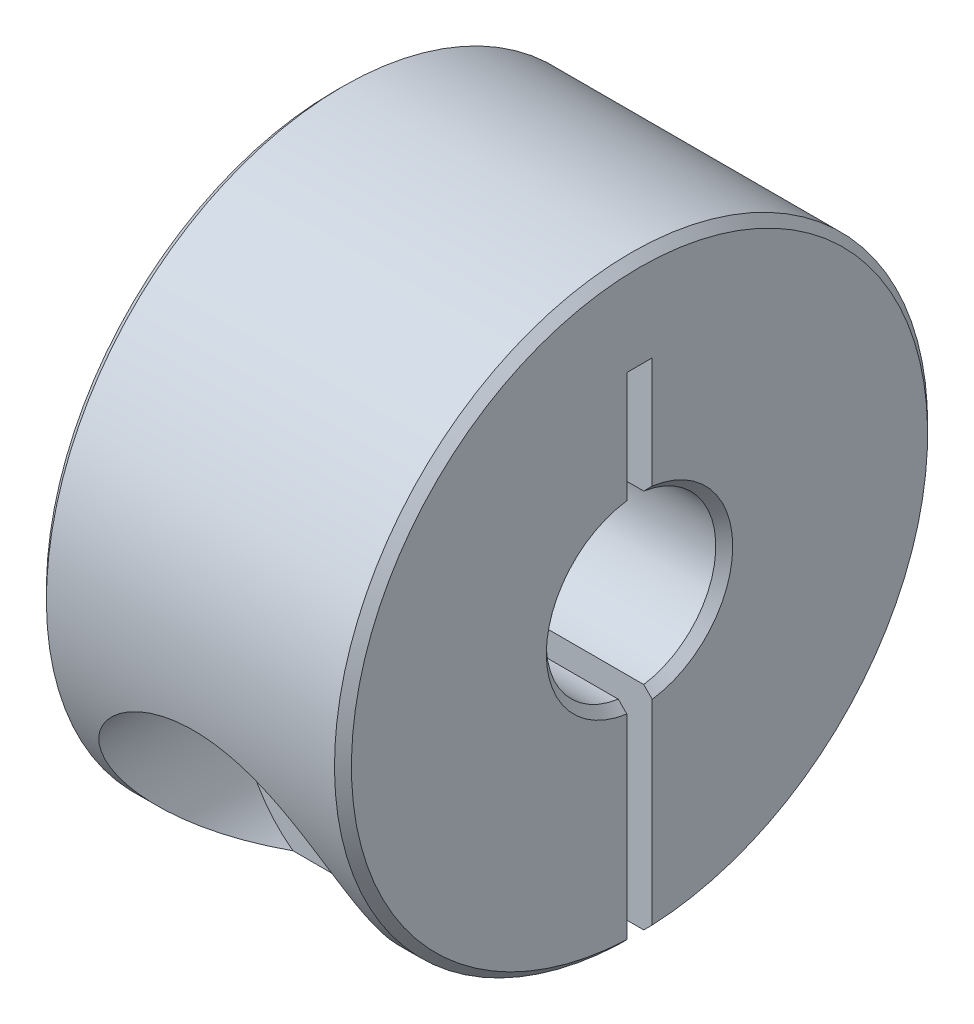
ISO-10303-21;
HEADER;
FILE_DESCRIPTION(('STEP AP214'),'2;1');
FILE_NAME('part.step','',(''),(''),'','','');
FILE_SCHEMA(('AUTOMOTIVE_DESIGN { 1 0 10303 214 1 1 1 1 }'));
ENDSEC;
DATA;
#1=APPLICATION_CONTEXT('core data for automotive mechanical design processes');
#2=APPLICATION_PROTOCOL_DEFINITION('international standard','automotive_design',2000,#1);
#3=PRODUCT_CONTEXT('',#1,'mechanical');
#4=PRODUCT('Part','Part','',(#3));
#5=PRODUCT_RELATED_PRODUCT_CATEGORY('part','',(#4));
#6=PRODUCT_DEFINITION_FORMATION('','',#4);
#7=PRODUCT_DEFINITION_CONTEXT('part definition',#1,'design');
#8=PRODUCT_DEFINITION('design','',#6,#7);
#9=PRODUCT_DEFINITION_SHAPE('','',#8);
#10=(LENGTH_UNIT() NAMED_UNIT(*) SI_UNIT(.MILLI.,.METRE.));
#11=(NAMED_UNIT(*) PLANE_ANGLE_UNIT() SI_UNIT($,.RADIAN.));
#12=(NAMED_UNIT(*) SI_UNIT($,.STERADIAN.) SOLID_ANGLE_UNIT());
#13=UNCERTAINTY_MEASURE_WITH_UNIT(LENGTH_MEASURE(1.E-05),#10,'distance_accuracy_value','');
#14=(GEOMETRIC_REPRESENTATION_CONTEXT(3) GLOBAL_UNCERTAINTY_ASSIGNED_CONTEXT((#13)) GLOBAL_UNIT_ASSIGNED_CONTEXT((#10,
#11,#12)) REPRESENTATION_CONTEXT('',''));
#15=CARTESIAN_POINT('',(0.,0.,0.));
#16=DIRECTION('',(0.,0.,1.));
#17=DIRECTION('',(1.,0.,0.));
#18=AXIS2_PLACEMENT_3D('',#15,#16,#17);
#19=CARTESIAN_POINT('',(9.,12.,-0.75));
#20=DIRECTION('',(0.,1.,0.));
#21=DIRECTION('',(0.,0.,1.));
#22=AXIS2_PLACEMENT_3D('',#19,#20,#21);
#23=PLANE('',#22);
#24=DIRECTION('',(-1.,0.,0.));
#25=VECTOR('',#24,1.);
#26=CARTESIAN_POINT('',(9.,12.,-0.75));
#27=LINE('',#26,#25);
#28=CARTESIAN_POINT('',(-9.,12.,-0.75));
#29=VERTEX_POINT('',#28);
#30=CARTESIAN_POINT('',(9.,12.,-0.75));
#31=VERTEX_POINT('',#30);
#32=EDGE_CURVE('E314',#29,#31,#27,.F.);
#33=ORIENTED_EDGE('',*,*,#32,.T.);
#34=DIRECTION('',(0.,0.,1.));
#35=VECTOR('',#34,1.);
#36=CARTESIAN_POINT('',(9.,12.,-0.75));
#37=LINE('',#36,#35);
#38=CARTESIAN_POINT('',(9.,12.,0.75));
#39=VERTEX_POINT('',#38);
#40=EDGE_CURVE('E160',#39,#31,#37,.F.);
#41=ORIENTED_EDGE('',*,*,#40,.F.);
#42=DIRECTION('',(1.,0.,0.));
#43=VECTOR('',#42,1.);
#44=CARTESIAN_POINT('',(9.,12.,0.75));
#45=LINE('',#44,#43);
#46=CARTESIAN_POINT('',(-9.,12.,0.75));
#47=VERTEX_POINT('',#46);
#48=EDGE_CURVE('E159',#39,#47,#45,.F.);
#49=ORIENTED_EDGE('',*,*,#48,.T.);
#50=DIRECTION('',(0.,0.,1.));
#51=VECTOR('',#50,1.);
#52=CARTESIAN_POINT('',(-9.,12.,-0.75));
#53=LINE('',#52,#51);
#54=EDGE_CURVE('E131',#29,#47,#53,.T.);
#55=ORIENTED_EDGE('',*,*,#54,.F.);
#56=EDGE_LOOP('',(#33,#41,#49,#55));
#57=FACE_BOUND('',#56,.T.);
#58=ADVANCED_FACE('F17',(#57),#23,.F.);
#59=CARTESIAN_POINT('',(0.,0.,0.));
#60=DIRECTION('',(1.,0.,0.));
#61=DIRECTION('',(0.,0.,-1.));
#62=AXIS2_PLACEMENT_3D('',#59,#60,#61);
#63=CYLINDRICAL_SURFACE('',#62,5.);
#64=CARTESIAN_POINT('',(8.50000000002638,0.,0.));
#65=DIRECTION('',(1.,0.,0.));
#66=DIRECTION('',(0.,1.,0.));
#67=AXIS2_PLACEMENT_3D('',#64,#65,#66);
#68=CIRCLE('',#67,4.99999999999545);
#69=CARTESIAN_POINT('',(8.50000000002865,4.943429983319,0.75));
#70=VERTEX_POINT('',#69);
#71=CARTESIAN_POINT('',(8.50000000002236,-4.94342998331493,0.75));
#72=VERTEX_POINT('',#71);
#73=EDGE_CURVE('E130',#70,#72,#68,.T.);
#74=ORIENTED_EDGE('',*,*,#73,.T.);
#75=DIRECTION('',(1.,0.,0.));
#76=VECTOR('',#75,1.);
#77=CARTESIAN_POINT('',(9.,-4.9434299833213,0.75));
#78=LINE('',#77,#76);
#79=CARTESIAN_POINT('',(-8.50000000002865,-4.943429983319,0.75));
#80=VERTEX_POINT('',#79);
#81=EDGE_CURVE('E322',#72,#80,#78,.F.);
#82=ORIENTED_EDGE('',*,*,#81,.T.);
#83=CARTESIAN_POINT('',(-8.50000000002638,0.,0.));
#84=DIRECTION('',(-1.,0.,0.));
#85=DIRECTION('',(0.,1.,0.));
#86=AXIS2_PLACEMENT_3D('',#83,#84,#85);
#87=CIRCLE('',#86,4.99999999999545);
#88=CARTESIAN_POINT('',(-8.50000000002865,4.943429983319,0.75));
#89=VERTEX_POINT('',#88);
#90=EDGE_CURVE('E319',#80,#89,#87,.T.);
#91=ORIENTED_EDGE('',*,*,#90,.T.);
#92=DIRECTION('',(1.,0.,0.));
#93=VECTOR('',#92,1.);
#94=CARTESIAN_POINT('',(9.,4.9434299833213,0.75));
#95=LINE('',#94,#93);
#96=EDGE_CURVE('E156',#89,#70,#95,.T.);
#97=ORIENTED_EDGE('',*,*,#96,.T.);
#98=EDGE_LOOP('',(#74,#82,#91,#97));
#99=FACE_BOUND('',#98,.T.);
#100=ADVANCED_FACE('F395',(#99),#63,.F.);
#101=CARTESIAN_POINT('',(0.,-10.,3.5));
#102=DIRECTION('',(0.,0.,1.));
#103=DIRECTION('',(1.,0.,0.));
#104=AXIS2_PLACEMENT_3D('',#101,#102,#103);
#105=CYLINDRICAL_SURFACE('',#104,3.3);
#106=CARTESIAN_POINT('',(0.,-10.,0.75));
#107=DIRECTION('',(0.,0.,1.));
#108=DIRECTION('',(1.,0.,0.));
#109=AXIS2_PLACEMENT_3D('',#106,#107,#108);
#110=CIRCLE('',#109,3.3);
#111=CARTESIAN_POINT('',(3.3,-10.,0.75));
#112=VERTEX_POINT('',#111);
#113=EDGE_CURVE('E334',#112,#112,#110,.F.);
#114=ORIENTED_EDGE('',*,*,#113,.T.);
#115=EDGE_LOOP('',(#114));
#116=FACE_BOUND('',#115,.T.);
#117=CARTESIAN_POINT('',(0.,-10.,7.));
#118=DIRECTION('',(0.,0.,1.));
#119=DIRECTION('',(1.,0.,0.));
#120=AXIS2_PLACEMENT_3D('',#117,#118,#119);
#121=CIRCLE('',#120,3.3);
#122=CARTESIAN_POINT('',(3.3,-10.,7.));
#123=VERTEX_POINT('',#122);
#124=EDGE_CURVE('E140',#123,#123,#121,.T.);
#125=ORIENTED_EDGE('',*,*,#124,.T.);
#126=EDGE_LOOP('',(#125));
#127=FACE_BOUND('',#126,.T.);
#128=ADVANCED_FACE('F407',(#116,#127),#105,.F.);
#129=CARTESIAN_POINT('',(9.00000000001455,0.,0.));
#130=DIRECTION('',(1.,0.,0.));
#131=DIRECTION('',(0.,0.,-1.));
#132=AXIS2_PLACEMENT_3D('',#129,#130,#131);
#133=CONICAL_SURFACE('',#132,5.49999999998363,0.785398163397448);
#134=CARTESIAN_POINT('',(8.5,0.,0.));
#135=DIRECTION('',(1.,0.,0.));
#136=DIRECTION('',(0.,0.,-1.));
#137=AXIS2_PLACEMENT_3D('',#134,#135,#136);
#138=CIRCLE('',#137,5.);
#139=CARTESIAN_POINT('',(8.50000000000863,4.94342998331439,-0.75));
#140=VERTEX_POINT('',#139);
#141=CARTESIAN_POINT('',(8.50000000001133,-4.94342998331712,-0.75));
#142=VERTEX_POINT('',#141);
#143=EDGE_CURVE('E133',#140,#142,#138,.F.);
#144=ORIENTED_EDGE('',*,*,#143,.T.);
#145=CARTESIAN_POINT('',(9.00000000001252,-5.44862367941236,-0.750000000003947));
#146=CARTESIAN_POINT('',(8.91662480487354,-5.36446616199563,-0.750000000001974));
#147=CARTESIAN_POINT('',(8.83327054076079,-5.28028792873627,-0.750000000000658));
#148=CARTESIAN_POINT('',(8.66660387409726,-5.11189003003671,-0.749999999999342));
#149=CARTESIAN_POINT('',(8.58329147154672,-5.02767036459626,-0.749999999999342));
#150=CARTESIAN_POINT('',(8.50000000002266,-4.94342998331294,-0.75));
#151=B_SPLINE_CURVE_WITH_KNOTS('',3,(#145,#146,#147,#148,#149,#150),.UNSPECIFIED.,.F.,.F.,(4,2,
4),(0.,0.355394393180337,0.710788788452376),.UNSPECIFIED.);
#152=CARTESIAN_POINT('',(9.00000000001481,-5.44862367940958,-0.75));
#153=VERTEX_POINT('',#152);
#154=EDGE_CURVE('E20',#153,#142,#151,.T.);
#155=ORIENTED_EDGE('',*,*,#154,.F.);
#156=CARTESIAN_POINT('',(9.00000000001455,0.,0.));
#157=DIRECTION('',(1.,0.,0.));
#158=DIRECTION('',(0.,0.,-1.));
#159=AXIS2_PLACEMENT_3D('',#156,#157,#158);
#160=CIRCLE('',#159,5.49999999998363);
#161=CARTESIAN_POINT('',(9.00000000001499,5.44862367940976,-0.75));
#162=VERTEX_POINT('',#161);
#163=EDGE_CURVE('E308',#162,#153,#160,.F.);
#164=ORIENTED_EDGE('',*,*,#163,.F.);
#165=CARTESIAN_POINT('',(9.00000000001543,5.4486236794102,-0.75));
#166=CARTESIAN_POINT('',(8.91662480487422,5.36446616199377,-0.75));
#167=CARTESIAN_POINT('',(8.83327054075965,5.28028792873427,-0.75));
#168=CARTESIAN_POINT('',(8.66660387409335,5.11189003003361,-0.75));
#169=CARTESIAN_POINT('',(8.58329147154186,5.0276703645922,-0.75));
#170=CARTESIAN_POINT('',(8.50000000001727,4.94342998330749,-0.75));
#171=B_SPLINE_CURVE_WITH_KNOTS('',3,(#165,#166,#167,#168,#169,#170),.UNSPECIFIED.,.F.,.F.,(4,2,
4),(0.,0.35539439318443,0.710788788460557),.UNSPECIFIED.);
#172=EDGE_CURVE('E135',#162,#140,#171,.T.);
#173=ORIENTED_EDGE('',*,*,#172,.T.);
#174=EDGE_LOOP('',(#144,#155,#164,#173));
#175=FACE_BOUND('',#174,.T.);
#176=ADVANCED_FACE('F134',(#175),#133,.F.);
#177=CARTESIAN_POINT('',(9.00000000001455,0.,0.));
#178=DIRECTION('',(1.,0.,0.));
#179=DIRECTION('',(0.,0.,-1.));
#180=AXIS2_PLACEMENT_3D('',#177,#178,#179);
#181=CONICAL_SURFACE('',#180,5.49999999998363,0.785398163397448);
#182=CARTESIAN_POINT('',(9.00000000001455,0.,0.));
#183=DIRECTION('',(1.,0.,0.));
#184=DIRECTION('',(0.,0.,-1.));
#185=AXIS2_PLACEMENT_3D('',#182,#183,#184);
#186=CIRCLE('',#185,5.49999999998363);
#187=CARTESIAN_POINT('',(9.00000000001499,-5.44862367940976,0.75));
#188=VERTEX_POINT('',#187);
#189=CARTESIAN_POINT('',(9.00000000001499,5.44862367940976,0.75));
#190=VERTEX_POINT('',#189);
#191=EDGE_CURVE('E304',#188,#190,#186,.F.);
#192=ORIENTED_EDGE('',*,*,#191,.F.);
#193=CARTESIAN_POINT('',(9.00000000001543,-5.4486236794102,0.75));
#194=CARTESIAN_POINT('',(8.9166248048744,-5.36446616199395,0.75));
#195=CARTESIAN_POINT('',(8.83327054076001,-5.28028792873464,0.75));
#196=CARTESIAN_POINT('',(8.66660387409407,-5.11189003003434,0.75));
#197=CARTESIAN_POINT('',(8.58329147154276,-5.0276703645931,0.75));
#198=CARTESIAN_POINT('',(8.50000000001834,-4.94342998330857,0.75));
#199=B_SPLINE_CURVE_WITH_KNOTS('',3,(#193,#194,#195,#196,#197,#198),.UNSPECIFIED.,.F.,.F.,(4,2,
4),(0.,0.355394393183667,0.710788788459035),.UNSPECIFIED.);
#200=EDGE_CURVE('E324',#188,#72,#199,.T.);
#201=ORIENTED_EDGE('',*,*,#200,.T.);
#202=ORIENTED_EDGE('',*,*,#73,.F.);
#203=CARTESIAN_POINT('',(8.50000000001834,4.94342998330857,0.75));
#204=CARTESIAN_POINT('',(8.58329147154276,5.0276703645931,0.75));
#205=CARTESIAN_POINT('',(8.66660387409407,5.11189003003433,0.75));
#206=CARTESIAN_POINT('',(8.83327054076001,5.28028792873464,0.75));
#207=CARTESIAN_POINT('',(8.9166248048744,5.36446616199395,0.75));
#208=CARTESIAN_POINT('',(9.00000000001543,5.4486236794102,0.75));
#209=B_SPLINE_CURVE_WITH_KNOTS('',3,(#203,#204,#205,#206,#207,#208),.UNSPECIFIED.,.F.,.F.,(4,2,
4),(0.,0.355394395275367,0.710788788459035),.UNSPECIFIED.);
#210=EDGE_CURVE('E158',#70,#190,#209,.T.);
#211=ORIENTED_EDGE('',*,*,#210,.T.);
#212=EDGE_LOOP('',(#192,#201,#202,#211));
#213=FACE_BOUND('',#212,.T.);
#214=ADVANCED_FACE('F372',(#213),#181,.F.);
#215=CARTESIAN_POINT('',(9.,-17.5,-0.75));
#216=DIRECTION('',(0.,0.,-1.));
#217=DIRECTION('',(-1.,0.,0.));
#218=AXIS2_PLACEMENT_3D('',#215,#216,#217);
#219=PLANE('',#218);
#220=DIRECTION('',(0.,1.,0.));
#221=VECTOR('',#220,1.);
#222=CARTESIAN_POINT('',(9.,11.25,-0.75));
#223=LINE('',#222,#221);
#224=EDGE_CURVE('E309',#31,#162,#223,.F.);
#225=ORIENTED_EDGE('',*,*,#224,.F.);
#226=ORIENTED_EDGE('',*,*,#32,.F.);
#227=DIRECTION('',(0.,1.,0.));
#228=VECTOR('',#227,1.);
#229=CARTESIAN_POINT('',(-9.,11.25,-0.75));
#230=LINE('',#229,#228);
#231=CARTESIAN_POINT('',(-9.00000000000753,5.44862367940223,-0.75));
#232=VERTEX_POINT('',#231);
#233=EDGE_CURVE('E288',#232,#29,#230,.T.);
#234=ORIENTED_EDGE('',*,*,#233,.F.);
#235=CARTESIAN_POINT('',(-9.00000000001252,5.44862367941236,-0.750000000003948));
#236=CARTESIAN_POINT('',(-8.91662480487354,5.36446616199563,-0.750000000001974));
#237=CARTESIAN_POINT('',(-8.83327054076079,5.28028792873627,-0.750000000000658));
#238=CARTESIAN_POINT('',(-8.66660387409726,5.11189003003671,-0.749999999999342));
#239=CARTESIAN_POINT('',(-8.58329147154672,5.02767036459626,-0.749999999999342));
#240=CARTESIAN_POINT('',(-8.50000000002266,4.94342998331294,-0.75));
#241=B_SPLINE_CURVE_WITH_KNOTS('',3,(#235,#236,#237,#238,#239,#240),.UNSPECIFIED.,.F.,.F.,(4,2,
4),(0.,0.355394393180337,0.710788788452376),.UNSPECIFIED.);
#242=CARTESIAN_POINT('',(-8.50000000001133,4.94342998331712,-0.75));
#243=VERTEX_POINT('',#242);
#244=EDGE_CURVE('E330',#232,#243,#241,.T.);
#245=ORIENTED_EDGE('',*,*,#244,.T.);
#246=DIRECTION('',(1.,0.,0.));
#247=VECTOR('',#246,1.);
#248=CARTESIAN_POINT('',(0.,4.9434299833213,-0.75));
#249=LINE('',#248,#247);
#250=EDGE_CURVE('E154',#243,#140,#249,.T.);
#251=ORIENTED_EDGE('',*,*,#250,.T.);
#252=ORIENTED_EDGE('',*,*,#172,.F.);
#253=EDGE_LOOP('',(#225,#226,#234,#245,#251,#252));
#254=FACE_BOUND('',#253,.T.);
#255=ADVANCED_FACE('F329',(#254),#219,.F.);
#256=CARTESIAN_POINT('',(9.,12.,0.75));
#257=DIRECTION('',(0.,0.,1.));
#258=DIRECTION('',(1.,0.,0.));
#259=AXIS2_PLACEMENT_3D('',#256,#257,#258);
#260=PLANE('',#259);
#261=ORIENTED_EDGE('',*,*,#96,.F.);
#262=CARTESIAN_POINT('',(-8.50000000002536,4.94342998331567,0.75));
#263=CARTESIAN_POINT('',(-8.58329147154855,5.02767036459896,0.75));
#264=CARTESIAN_POINT('',(-8.66660387409863,5.11189003003895,0.75));
#265=CARTESIAN_POINT('',(-8.83327054076211,5.28028792873676,0.75));
#266=CARTESIAN_POINT('',(-8.91662480487527,5.36446616199483,0.75));
#267=CARTESIAN_POINT('',(-9.00000000001507,5.44862367940984,0.75));
#268=B_SPLINE_CURVE_WITH_KNOTS('',3,(#262,#263,#264,#265,#266,#267),.UNSPECIFIED.,.F.,.F.,(4,2,
4),(0.,0.355394395270117,0.710788788448535),.UNSPECIFIED.);
#269=CARTESIAN_POINT('',(-9.00000000001481,5.44862367940958,0.75));
#270=VERTEX_POINT('',#269);
#271=EDGE_CURVE('E321',#89,#270,#268,.T.);
#272=ORIENTED_EDGE('',*,*,#271,.T.);
#273=DIRECTION('',(0.,1.,0.));
#274=VECTOR('',#273,1.);
#275=CARTESIAN_POINT('',(-9.,11.25,0.75));
#276=LINE('',#275,#274);
#277=EDGE_CURVE('E285',#47,#270,#276,.F.);
#278=ORIENTED_EDGE('',*,*,#277,.F.);
#279=ORIENTED_EDGE('',*,*,#48,.F.);
#280=DIRECTION('',(0.,1.,0.));
#281=VECTOR('',#280,1.);
#282=CARTESIAN_POINT('',(9.,11.25,0.75));
#283=LINE('',#282,#281);
#284=EDGE_CURVE('E290',#190,#39,#283,.T.);
#285=ORIENTED_EDGE('',*,*,#284,.F.);
#286=ORIENTED_EDGE('',*,*,#210,.F.);
#287=EDGE_LOOP('',(#261,#272,#278,#279,#285,#286));
#288=FACE_BOUND('',#287,.T.);
#289=ADVANCED_FACE('F358',(#288),#260,.F.);
#290=CARTESIAN_POINT('',(-9.00000000001455,0.,0.));
#291=DIRECTION('',(-1.,0.,0.));
#292=DIRECTION('',(0.,0.,1.));
#293=AXIS2_PLACEMENT_3D('',#290,#291,#292);
#294=CONICAL_SURFACE('',#293,5.49999999998363,0.785398163397448);
#295=ORIENTED_EDGE('',*,*,#90,.F.);
#296=CARTESIAN_POINT('',(-8.50000000001997,-4.94342998331022,0.75));
#297=CARTESIAN_POINT('',(-8.58329147154412,-5.02767036459448,0.75));
#298=CARTESIAN_POINT('',(-8.66660387409516,-5.11189003003544,0.75));
#299=CARTESIAN_POINT('',(-8.83327054076056,-5.28028792873519,0.75));
#300=CARTESIAN_POINT('',(-8.91662480487467,-5.36446616199422,0.75));
#301=CARTESIAN_POINT('',(-9.00000000001543,-5.4486236794102,0.75));
#302=B_SPLINE_CURVE_WITH_KNOTS('',3,(#296,#297,#298,#299,#300,#301),.UNSPECIFIED.,.F.,.F.,(4,2,
4),(0.,0.355394395274206,0.710788788456713),.UNSPECIFIED.);
#303=CARTESIAN_POINT('',(-9.00000000001499,-5.44862367940976,0.75));
#304=VERTEX_POINT('',#303);
#305=EDGE_CURVE('E223',#80,#304,#302,.T.);
#306=ORIENTED_EDGE('',*,*,#305,.T.);
#307=CARTESIAN_POINT('',(-9.00000000001455,0.,0.));
#308=DIRECTION('',(-1.,0.,0.));
#309=DIRECTION('',(0.,0.,1.));
#310=AXIS2_PLACEMENT_3D('',#307,#308,#309);
#311=CIRCLE('',#310,5.49999999998363);
#312=EDGE_CURVE('E284',#270,#304,#311,.F.);
#313=ORIENTED_EDGE('',*,*,#312,.F.);
#314=ORIENTED_EDGE('',*,*,#271,.F.);
#315=EDGE_LOOP('',(#295,#306,#313,#314));
#316=FACE_BOUND('',#315,.T.);
#317=ADVANCED_FACE('F354',(#316),#294,.F.);
#318=CARTESIAN_POINT('',(-9.00000000001455,0.,0.));
#319=DIRECTION('',(-1.,0.,0.));
#320=DIRECTION('',(0.,0.,1.));
#321=AXIS2_PLACEMENT_3D('',#318,#319,#320);
#322=CONICAL_SURFACE('',#321,5.49999999998363,0.785398163397448);
#323=CARTESIAN_POINT('',(-9.00000000001455,0.,0.));
#324=DIRECTION('',(-1.,0.,0.));
#325=DIRECTION('',(0.,0.,1.));
#326=AXIS2_PLACEMENT_3D('',#323,#324,#325);
#327=CIRCLE('',#326,5.49999999998363);
#328=CARTESIAN_POINT('',(-9.00000000001481,-5.44862367940958,-0.75));
#329=VERTEX_POINT('',#328);
#330=EDGE_CURVE('E192',#329,#232,#327,.F.);
#331=ORIENTED_EDGE('',*,*,#330,.F.);
#332=CARTESIAN_POINT('',(-8.50000000001996,-4.94342998331561,-0.750000000004225));
#333=CARTESIAN_POINT('',(-8.58329147154495,-5.02767036459802,-0.750000000002113));
#334=CARTESIAN_POINT('',(-8.66660387409638,-5.11189003003757,-0.750000000000704));
#335=CARTESIAN_POINT('',(-8.83327054076166,-5.2802879287354,-0.749999999999296));
#336=CARTESIAN_POINT('',(-8.91662480487527,-5.36446616199393,-0.749999999999296));
#337=CARTESIAN_POINT('',(-9.00000000001507,-5.44862367940984,-0.75));
#338=B_SPLINE_CURVE_WITH_KNOTS('',3,(#332,#333,#334,#335,#336,#337),.UNSPECIFIED.,.F.,.F.,(4,2,
4),(0.,0.355394395272037,0.710788788452374),.UNSPECIFIED.);
#339=CARTESIAN_POINT('',(-8.50000000001133,-4.94342998331712,-0.75));
#340=VERTEX_POINT('',#339);
#341=EDGE_CURVE('E335',#340,#329,#338,.T.);
#342=ORIENTED_EDGE('',*,*,#341,.F.);
#343=CARTESIAN_POINT('',(-8.5,0.,0.));
#344=DIRECTION('',(1.,0.,0.));
#345=DIRECTION('',(0.,0.,-1.));
#346=AXIS2_PLACEMENT_3D('',#343,#344,#345);
#347=CIRCLE('',#346,5.);
#348=EDGE_CURVE('E139',#340,#243,#347,.T.);
#349=ORIENTED_EDGE('',*,*,#348,.T.);
#350=ORIENTED_EDGE('',*,*,#244,.F.);
#351=EDGE_LOOP('',(#331,#342,#349,#350));
#352=FACE_BOUND('',#351,.T.);
#353=ADVANCED_FACE('F351',(#352),#322,.F.);
#354=CARTESIAN_POINT('',(9.,12.,0.75));
#355=DIRECTION('',(0.,0.,1.));
#356=DIRECTION('',(1.,0.,0.));
#357=AXIS2_PLACEMENT_3D('',#354,#355,#356);
#358=PLANE('',#357);
#359=DIRECTION('',(0.,1.,0.));
#360=VECTOR('',#359,1.);
#361=CARTESIAN_POINT('',(-9.,11.25,0.75));
#362=LINE('',#361,#360);
#363=CARTESIAN_POINT('',(-9.,-16.9834478242788,0.75));
#364=VERTEX_POINT('',#363);
#365=EDGE_CURVE('E281',#304,#364,#362,.F.);
#366=ORIENTED_EDGE('',*,*,#365,.F.);
#367=ORIENTED_EDGE('',*,*,#305,.F.);
#368=ORIENTED_EDGE('',*,*,#81,.F.);
#369=ORIENTED_EDGE('',*,*,#200,.F.);
#370=DIRECTION('',(0.,1.,0.));
#371=VECTOR('',#370,1.);
#372=CARTESIAN_POINT('',(9.,11.25,0.75));
#373=LINE('',#372,#371);
#374=CARTESIAN_POINT('',(8.99999999999999,-16.9834478242788,0.75));
#375=VERTEX_POINT('',#374);
#376=EDGE_CURVE('E305',#375,#188,#373,.T.);
#377=ORIENTED_EDGE('',*,*,#376,.F.);
#378=CARTESIAN_POINT('',(8.49999999999999,-17.4839211849059,0.75));
#379=CARTESIAN_POINT('',(8.58333447834012,-17.4005101020586,0.75));
#380=CARTESIAN_POINT('',(8.66666838417682,-17.3170984472494,0.75));
#381=CARTESIAN_POINT('',(8.83333505084349,-17.1502739937071,0.75));
#382=CARTESIAN_POINT('',(8.91666781167346,-17.0668611949739,0.75));
#383=CARTESIAN_POINT('',(8.99999999999999,-16.9834478242788,0.75));
#384=B_SPLINE_CURVE_WITH_KNOTS('',3,(#378,#379,#380,#381,#382,#383),.UNSPECIFIED.,.F.,.F.,(4,2,
4),(0.,0.353720788447701,0.707441576895888),.UNSPECIFIED.);
#385=CARTESIAN_POINT('',(8.49999999999999,-17.4839211849059,0.750000000000003));
#386=VERTEX_POINT('',#385);
#387=EDGE_CURVE('E208',#386,#375,#384,.T.);
#388=ORIENTED_EDGE('',*,*,#387,.F.);
#389=DIRECTION('',(1.,0.,0.));
#390=VECTOR('',#389,1.);
#391=CARTESIAN_POINT('',(0.,-17.4839211849059,0.750000000000005));
#392=LINE('',#391,#390);
#393=CARTESIAN_POINT('',(-8.5,-17.4839211849059,0.750000000000003));
#394=VERTEX_POINT('',#393);
#395=EDGE_CURVE('E189',#394,#386,#392,.T.);
#396=ORIENTED_EDGE('',*,*,#395,.F.);
#397=CARTESIAN_POINT('',(-8.99999999999999,-16.9834478242788,0.75));
#398=CARTESIAN_POINT('',(-8.91666781167346,-17.0668611949739,0.75));
#399=CARTESIAN_POINT('',(-8.83333505084349,-17.1502739937071,0.75));
#400=CARTESIAN_POINT('',(-8.66666838417683,-17.3170984472494,0.75));
#401=CARTESIAN_POINT('',(-8.58333447834012,-17.4005101020586,0.75));
#402=CARTESIAN_POINT('',(-8.49999999999999,-17.4839211849059,0.75));
#403=B_SPLINE_CURVE_WITH_KNOTS('',3,(#397,#398,#399,#400,#401,#402),.UNSPECIFIED.,.F.,.F.,(4,2,
4),(0.,0.353720788448187,0.707441576895889),.UNSPECIFIED.);
#404=EDGE_CURVE('E216',#364,#394,#403,.T.);
#405=ORIENTED_EDGE('',*,*,#404,.F.);
#406=EDGE_LOOP('',(#366,#367,#368,#369,#377,#388,#396,#405));
#407=FACE_BOUND('',#406,.T.);
#408=ORIENTED_EDGE('',*,*,#113,.F.);
#409=EDGE_LOOP('',(#408));
#410=FACE_BOUND('',#409,.T.);
#411=ADVANCED_FACE('F200',(#407,#410),#358,.F.);
#412=CARTESIAN_POINT('',(0.,-10.,12.25));
#413=DIRECTION('',(0.,0.,1.));
#414=DIRECTION('',(1.,0.,0.));
#415=AXIS2_PLACEMENT_3D('',#412,#413,#414);
#416=CYLINDRICAL_SURFACE('',#415,7.5);
#417=CARTESIAN_POINT('',(0.,-10.,7.));
#418=DIRECTION('',(0.,0.,1.));
#419=DIRECTION('',(1.,0.,0.));
#420=AXIS2_PLACEMENT_3D('',#417,#418,#419);
#421=CIRCLE('',#420,7.5);
#422=CARTESIAN_POINT('',(-4.44750476637281,-16.0390149323454,7.00000000000001));
#423=VERTEX_POINT('',#422);
#424=CARTESIAN_POINT('',(4.44750476637281,-16.0390149323454,7.00000000000001));
#425=VERTEX_POINT('',#424);
#426=EDGE_CURVE('E215',#423,#425,#421,.F.);
#427=ORIENTED_EDGE('',*,*,#426,.T.);
#428=CARTESIAN_POINT('',(-4.44750476637281,-16.0390149323454,7.00000000000001));
#429=CARTESIAN_POINT('',(-4.56955954804997,-15.949117850043,7.2059721413126));
#430=CARTESIAN_POINT('',(-4.68980772098714,-15.8548595072587,7.41112964493417));
#431=CARTESIAN_POINT('',(-4.92616959264832,-15.6574374103529,7.81960057378549));
#432=CARTESIAN_POINT('',(-5.04228236783799,-15.5542716843945,8.02291357963219));
#433=CARTESIAN_POINT('',(-5.27019246544305,-15.338517814014,8.42809117848523));
#434=CARTESIAN_POINT('',(-5.38197340596297,-15.225898200416,8.62994829230589));
#435=CARTESIAN_POINT('',(-5.60013328646501,-14.9914073444316,9.03115149250275));
#436=CARTESIAN_POINT('',(-5.70651256869427,-14.8695366894116,9.23049773736342));
#437=CARTESIAN_POINT('',(-6.01935044847393,-14.4863371116097,9.82969393443101));
#438=CARTESIAN_POINT('',(-6.21640935120704,-14.2103061873441,10.2252405037687));
#439=CARTESIAN_POINT('',(-6.57827451089856,-13.6188741865275,11.0006097979159));
#440=CARTESIAN_POINT('',(-6.7431323560203,-13.3035374306973,11.380456891509));
#441=CARTESIAN_POINT('',(-6.96838373174463,-12.7808835787557,11.9573047465954));
#442=CARTESIAN_POINT('',(-7.04281829511678,-12.5871153406868,12.1611941984241));
#443=CARTESIAN_POINT('',(-7.17704141941539,-12.1873573735817,12.5617809811371));
#444=CARTESIAN_POINT('',(-7.23682980040736,-11.9813674944362,12.7584782236367));
#445=CARTESIAN_POINT('',(-7.33947499918348,-11.5585956795266,13.1426826622273));
#446=CARTESIAN_POINT('',(-7.38240339553908,-11.3418638652688,13.3302256830082));
#447=CARTESIAN_POINT('',(-7.44947088343624,-10.8976685376711,13.6957469825321));
#448=CARTESIAN_POINT('',(-7.47361328043574,-10.670206919749,13.8737269387946));
#449=CARTESIAN_POINT('',(-7.49848271588394,-10.2451538094771,14.1895954358461));
#450=CARTESIAN_POINT('',(-7.50247716547214,-10.0490100161887,14.3291764736407));
#451=CARTESIAN_POINT('',(-7.4945298959265,-9.65135819305877,14.5999695979797));
#452=CARTESIAN_POINT('',(-7.48259158807835,-9.44985132053225,14.7311834696758));
#453=CARTESIAN_POINT('',(-7.44147519707964,-9.0427566947008,14.9845270014167));
#454=CARTESIAN_POINT('',(-7.41228895200982,-8.83716705392436,15.1066523298336));
#455=CARTESIAN_POINT('',(-7.33550729828882,-8.42376270944296,15.3410126660908));
#456=CARTESIAN_POINT('',(-7.28791176876009,-8.21594799113658,15.4532476089835));
#457=CARTESIAN_POINT('',(-7.1729348260074,-7.79858861992143,15.6680412512137));
#458=CARTESIAN_POINT('',(-7.10540254611961,-7.58904307209935,15.7705179878946));
#459=CARTESIAN_POINT('',(-6.95007658415378,-7.17230190780332,15.9643633634668));
#460=CARTESIAN_POINT('',(-6.86228250959072,-6.96510633693162,16.05573178713));
#461=CARTESIAN_POINT('',(-6.66629430887933,-6.55588067604768,16.227126051057));
#462=CARTESIAN_POINT('',(-6.5581118731649,-6.35384770088328,16.3071583454807));
#463=CARTESIAN_POINT('',(-6.32158545217565,-5.95762859071314,16.4560458862356));
#464=CARTESIAN_POINT('',(-6.19324429588402,-5.76344135947152,16.5249026981304));
#465=CARTESIAN_POINT('',(-5.93564450889938,-5.41096912997221,16.6433539851056));
#466=CARTESIAN_POINT('',(-5.80880910596174,-5.25135813723171,16.6942931230247));
#467=CARTESIAN_POINT('',(-5.54130728047943,-4.94176376545887,16.7885422689785));
#468=CARTESIAN_POINT('',(-5.40064148704705,-4.79177994902116,16.8318526237788));
#469=CARTESIAN_POINT('',(-5.10642876865464,-4.50301222294986,16.9113961599183));
#470=CARTESIAN_POINT('',(-4.95288263490244,-4.36422762640159,16.9476297755099));
#471=CARTESIAN_POINT('',(-4.63400445329441,-4.09923927399808,17.0136677266353));
#472=CARTESIAN_POINT('',(-4.46867241406142,-3.97303550893858,17.0434720668729));
#473=CARTESIAN_POINT('',(-4.13393816799166,-3.7389559784119,17.0963171573298));
#474=CARTESIAN_POINT('',(-3.96492843951601,-3.63056647494613,17.1195716354682));
#475=CARTESIAN_POINT('',(-3.61832678265506,-3.42747694054332,17.1613855150157));
#476=CARTESIAN_POINT('',(-3.44073492260367,-3.33277680063076,17.1799449538009));
#477=CARTESIAN_POINT('',(-3.07825480461131,-3.15786448220336,17.2129551235274));
#478=CARTESIAN_POINT('',(-2.89336903853971,-3.07764740707821,17.2274072440729));
#479=CARTESIAN_POINT('',(-2.5175771921715,-2.93229680733227,17.2527402403115));
#480=CARTESIAN_POINT('',(-2.32667146524109,-2.86716239923837,17.2636213251951));
#481=CARTESIAN_POINT('',(-1.78808006729213,-2.70738206624215,17.2896238418875));
#482=CARTESIAN_POINT('',(-1.43502832178842,-2.62974027866728,17.301362883775));
#483=CARTESIAN_POINT('',(-0.721246784950899,-2.52605284906673,17.3168086052384));
#484=CARTESIAN_POINT('',(-0.360516507560753,-2.50001048319565,17.320514774792));
#485=CARTESIAN_POINT('',(0.207537699336303,-2.49999396516315,17.3205042192316));
#486=CARTESIAN_POINT('',(0.415004556789632,-2.50861472107268,17.319269943086));
#487=CARTESIAN_POINT('',(0.828536408112774,-2.54302062382049,17.3142539947343));
#488=CARTESIAN_POINT('',(1.03460127266166,-2.56880733294401,17.3104720906664));
#489=CARTESIAN_POINT('',(1.44388981064271,-2.63737362100346,17.300157488468));
#490=CARTESIAN_POINT('',(1.64711231880478,-2.6801599693771,17.2936236944431));
#491=CARTESIAN_POINT('',(2.04919664635086,-2.78239527460306,17.277469580382));
#492=CARTESIAN_POINT('',(2.24805854865994,-2.84184391429394,17.2678493190952));
#493=CARTESIAN_POINT('',(2.64007282211928,-2.97696531380355,17.2450679607307));
#494=CARTESIAN_POINT('',(2.83322290460203,-3.0526444794239,17.2319054650935));
#495=CARTESIAN_POINT('',(3.212330931359,-3.21959973834868,17.2014933284278));
#496=CARTESIAN_POINT('',(3.39828883072303,-3.31087592902642,17.1842436618826));
#497=CARTESIAN_POINT('',(3.76161271288635,-3.50823601714022,17.1450399348971));
#498=CARTESIAN_POINT('',(3.93898027461467,-3.61431717935945,17.1230867430327));
#499=CARTESIAN_POINT('',(4.28384960669858,-3.84036222915873,17.0738101179102));
#500=CARTESIAN_POINT('',(4.45135152210617,-3.9603259125508,17.0464867636339));
#501=CARTESIAN_POINT('',(4.77345892734006,-4.21161941252672,16.9861345261793));
#502=CARTESIAN_POINT('',(4.92818712153963,-4.34280799071123,16.9531724729659));
#503=CARTESIAN_POINT('',(5.22570979548738,-4.61643218949201,16.8807160915363));
#504=CARTESIAN_POINT('',(5.368504399039,-4.75886769337873,16.8412218311003));
#505=CARTESIAN_POINT('',(5.64118296482405,-5.05355240989999,16.7551531477772));
#506=CARTESIAN_POINT('',(5.77106984734887,-5.20579938984092,16.7085803324278));
#507=CARTESIAN_POINT('',(6.01719634105576,-5.51859926731203,16.6078911710848));
#508=CARTESIAN_POINT('',(6.13343612001542,-5.67915206269547,16.5537749178482));
#509=CARTESIAN_POINT('',(6.34979760266607,-6.00406445320724,16.4386857538399));
#510=CARTESIAN_POINT('',(6.45016520758534,-6.16830870277123,16.3778489964661));
#511=CARTESIAN_POINT('',(6.63686042759788,-6.50163263278037,16.2484070951328));
#512=CARTESIAN_POINT('',(6.72318830223368,-6.67071222377003,16.179802094819));
#513=CARTESIAN_POINT('',(6.88171051431675,-7.01211054336769,16.0347964766847));
#514=CARTESIAN_POINT('',(6.95390493679214,-7.18442925248202,15.9583959057674));
#515=CARTESIAN_POINT('',(7.08429277599637,-7.53078078203522,15.7979041564588));
#516=CARTESIAN_POINT('',(7.14248486129418,-7.70481376384154,15.7138122477748));
#517=CARTESIAN_POINT('',(7.24698271622625,-8.05923731904919,15.535103568232));
#518=CARTESIAN_POINT('',(7.29280162667837,-8.23963738083422,15.4402215698269));
#519=CARTESIAN_POINT('',(7.37033431271274,-8.59927982624615,15.2428497773038));
#520=CARTESIAN_POINT('',(7.40204811766435,-8.77852221228278,15.140359999027));
#521=CARTESIAN_POINT('',(7.45208225155005,-9.13465940141239,14.9281937486412));
#522=CARTESIAN_POINT('',(7.47039885089145,-9.31155353733947,14.8185152845556));
#523=CARTESIAN_POINT('',(7.49443445683916,-9.66191634732272,14.5924935479782));
#524=CARTESIAN_POINT('',(7.50015114944814,-9.83538438637329,14.4761490552819));
#525=CARTESIAN_POINT('',(7.49977642825598,-10.2518548166548,14.185861730036));
#526=CARTESIAN_POINT('',(7.48753828444449,-10.4926244274418,14.0086948048062));
#527=CARTESIAN_POINT('',(7.44161639702245,-10.9635144860523,13.6433232588239));
#528=CARTESIAN_POINT('',(7.40792519058712,-11.1936311981842,13.4551148177787));
#529=CARTESIAN_POINT('',(7.32153756778539,-11.6423742726907,13.0687773256414));
#530=CARTESIAN_POINT('',(7.26880494707716,-11.8609778311189,12.8706299994799));
#531=CARTESIAN_POINT('',(7.14670959132682,-12.2854592651456,12.4660938526114));
#532=CARTESIAN_POINT('',(7.0773467007476,-12.4913370217014,12.259704954839));
#533=CARTESIAN_POINT('',(6.89313460145548,-12.9706332256824,11.7549100995458));
#534=CARTESIAN_POINT('',(6.77123297973118,-13.2377082214775,11.4530359110104));
#535=CARTESIAN_POINT('',(6.5039317247416,-13.7458440350776,10.8379467448169));
#536=CARTESIAN_POINT('',(6.35852056441788,-13.9868919942655,10.524726262668));
#537=CARTESIAN_POINT('',(6.04841834928229,-14.4432839705592,9.88911939742422));
#538=CARTESIAN_POINT('',(5.88371987218683,-14.6586180274484,9.56672952207081));
#539=CARTESIAN_POINT('',(5.53866216807283,-15.0639942008267,8.91478346660552));
#540=CARTESIAN_POINT('',(5.35830923850595,-15.2540464104544,8.58523020779469));
#541=CARTESIAN_POINT('',(5.05525394791196,-15.5425806962857,8.04570348018636));
#542=CARTESIAN_POINT('',(4.93645680827444,-15.6485687509192,7.837497550514));
#543=CARTESIAN_POINT('',(4.69489546045524,-15.8508683646362,7.41981093790982));
#544=CARTESIAN_POINT('',(4.5721461900734,-15.947211741929,7.21033703912617));
#545=CARTESIAN_POINT('',(4.44750476637281,-16.0390149323454,7.00000000000001));
#546=B_SPLINE_CURVE_WITH_KNOTS('',3,(#428,#429,#430,#431,#432,#433,#434,#435,#436,#437,#438,
#439,#440,#441,#442,#443,#444,#445,#446,#447,#448,#449,#450,#451,#452,#453,#454,#455,#456,#457,
#458,#459,#460,#461,#462,#463,#464,#465,#466,#467,#468,#469,#470,#471,#472,#473,#474,#475,#476,
#477,#478,#479,#480,#481,#482,#483,#484,#485,#486,#487,#488,#489,#490,#491,#492,#493,#494,#495,
#496,#497,#498,#499,#500,#501,#502,#503,#504,#505,#506,#507,#508,#509,#510,#511,#512,#513,#514,
#515,#516,#517,#518,#519,#520,#521,#522,#523,#524,#525,#526,#527,#528,#529,#530,#531,#532,#533,
#534,#535,#536,#537,#538,#539,#540,#541,#542,#543,#544,#545),.UNSPECIFIED.,.F.,.F.,(4,2,2,2,2,2,
2,2,2,2,2,2,2,2,2,2,2,2,2,2,2,2,2,2,2,2,2,2,2,2,2,2,2,2,2,2,2,2,2,2,2,2,2,2,2,2,2,2,2,2,2,2,2,2,
2,2,2,2,4),(0.,0.767197989332565,1.53456625168886,2.30459865619033,3.07458221067946,
4.63520776148976,6.19331220532603,7.06559048134463,7.93787947313029,8.80642408628925,
9.67481584160868,10.3964638176178,11.1179573098516,11.8397924946785,12.561632419242,
13.289081185085,14.0165440432979,14.7435910454256,15.4705361080916,16.1001571871404,
16.7297496394295,17.3593034456738,17.9888567913261,18.5945222287587,19.2001828444666,
19.8056383060621,20.4110582938907,21.4920093769257,22.5730290895942,23.1953371931048,
23.8177019410496,24.440314770068,25.0629157486536,25.6857629066985,26.308613953364,
26.9313500803238,27.5540770490712,28.1698787188229,28.7856739992291,29.4013296410885,
30.0169777132799,30.6218808829718,31.2267728689771,31.831661215786,32.4366070565061,
33.0627090501693,33.68880974017,34.3150846614832,34.9414745898209,35.8376700467136,
36.7341774313869,37.6323984417234,38.5306278531356,39.7919904027786,41.053973302413,
42.3164434531991,43.5784080723329,44.3645137106154,45.1479340049302),.UNSPECIFIED.);
#547=EDGE_CURVE('E180',#423,#425,#546,.T.);
#548=ORIENTED_EDGE('',*,*,#547,.F.);
#549=EDGE_LOOP('',(#427,#548));
#550=FACE_BOUND('',#549,.T.);
#551=ADVANCED_FACE('F194',(#550),#416,.F.);
#552=CARTESIAN_POINT('',(0.,-15.4,7.));
#553=DIRECTION('',(0.,0.,-1.));
#554=DIRECTION('',(0.,1.,0.));
#555=AXIS2_PLACEMENT_3D('',#552,#553,#554);
#556=PLANE('',#555);
#557=ORIENTED_EDGE('',*,*,#124,.F.);
#558=EDGE_LOOP('',(#557));
#559=FACE_BOUND('',#558,.T.);
#560=ORIENTED_EDGE('',*,*,#426,.F.);
#561=DIRECTION('',(1.,0.,0.));
#562=VECTOR('',#561,1.);
#563=CARTESIAN_POINT('',(0.,-16.0390149323454,7.00000000000002));
#564=LINE('',#563,#562);
#565=EDGE_CURVE('E188',#425,#423,#564,.F.);
#566=ORIENTED_EDGE('',*,*,#565,.F.);
#567=EDGE_LOOP('',(#560,#566));
#568=FACE_BOUND('',#567,.T.);
#569=ADVANCED_FACE('F199',(#559,#568),#556,.F.);
#570=CARTESIAN_POINT('',(0.,0.,0.));
#571=DIRECTION('',(1.,0.,0.));
#572=DIRECTION('',(0.,0.,-1.));
#573=AXIS2_PLACEMENT_3D('',#570,#571,#572);
#574=CYLINDRICAL_SURFACE('',#573,5.);
#575=ORIENTED_EDGE('',*,*,#348,.F.);
#576=DIRECTION('',(-1.,0.,0.));
#577=VECTOR('',#576,1.);
#578=CARTESIAN_POINT('',(9.,-4.9434299833213,-0.75));
#579=LINE('',#578,#577);
#580=EDGE_CURVE('E127',#340,#142,#579,.F.);
#581=ORIENTED_EDGE('',*,*,#580,.T.);
#582=ORIENTED_EDGE('',*,*,#143,.F.);
#583=ORIENTED_EDGE('',*,*,#250,.F.);
#584=EDGE_LOOP('',(#575,#581,#582,#583));
#585=FACE_BOUND('',#584,.T.);
#586=ADVANCED_FACE('F143',(#585),#574,.F.);
#587=CARTESIAN_POINT('',(9.,11.25,0.));
#588=DIRECTION('',(1.,0.,0.));
#589=DIRECTION('',(0.,0.,-1.));
#590=AXIS2_PLACEMENT_3D('',#587,#588,#589);
#591=PLANE('',#590);
#592=ORIENTED_EDGE('',*,*,#284,.T.);
#593=ORIENTED_EDGE('',*,*,#40,.T.);
#594=ORIENTED_EDGE('',*,*,#224,.T.);
#595=ORIENTED_EDGE('',*,*,#163,.T.);
#596=DIRECTION('',(0.,1.,0.));
#597=VECTOR('',#596,1.);
#598=CARTESIAN_POINT('',(9.,-17.5,-0.75));
#599=LINE('',#598,#597);
#600=CARTESIAN_POINT('',(9.,-16.9834478242788,-0.75));
#601=VERTEX_POINT('',#600);
#602=EDGE_CURVE('E129',#153,#601,#599,.F.);
#603=ORIENTED_EDGE('',*,*,#602,.T.);
#604=CARTESIAN_POINT('',(9.,0.,0.));
#605=DIRECTION('',(-1.,0.,0.));
#606=DIRECTION('',(0.,0.,1.));
#607=AXIS2_PLACEMENT_3D('',#604,#605,#606);
#608=CIRCLE('',#607,17.);
#609=EDGE_CURVE('E190',#375,#601,#608,.T.);
#610=ORIENTED_EDGE('',*,*,#609,.F.);
#611=ORIENTED_EDGE('',*,*,#376,.T.);
#612=ORIENTED_EDGE('',*,*,#191,.T.);
#613=EDGE_LOOP('',(#592,#593,#594,#595,#603,#610,#611,#612));
#614=FACE_BOUND('',#613,.T.);
#615=ADVANCED_FACE('F255',(#614),#591,.T.);
#616=CARTESIAN_POINT('',(-9.,11.25,0.));
#617=DIRECTION('',(-1.,0.,0.));
#618=DIRECTION('',(0.,0.,1.));
#619=AXIS2_PLACEMENT_3D('',#616,#617,#618);
#620=PLANE('',#619);
#621=DIRECTION('',(0.,1.,0.));
#622=VECTOR('',#621,1.);
#623=CARTESIAN_POINT('',(-9.,-17.5,-0.75));
#624=LINE('',#623,#622);
#625=CARTESIAN_POINT('',(-9.,-16.9834478242788,-0.75));
#626=VERTEX_POINT('',#625);
#627=EDGE_CURVE('E145',#626,#329,#624,.T.);
#628=ORIENTED_EDGE('',*,*,#627,.T.);
#629=ORIENTED_EDGE('',*,*,#330,.T.);
#630=ORIENTED_EDGE('',*,*,#233,.T.);
#631=ORIENTED_EDGE('',*,*,#54,.T.);
#632=ORIENTED_EDGE('',*,*,#277,.T.);
#633=ORIENTED_EDGE('',*,*,#312,.T.);
#634=ORIENTED_EDGE('',*,*,#365,.T.);
#635=CARTESIAN_POINT('',(-8.99999999999999,0.,0.));
#636=DIRECTION('',(1.,0.,0.));
#637=DIRECTION('',(0.,0.,-1.));
#638=AXIS2_PLACEMENT_3D('',#635,#636,#637);
#639=CIRCLE('',#638,17.);
#640=EDGE_CURVE('E169',#626,#364,#639,.T.);
#641=ORIENTED_EDGE('',*,*,#640,.F.);
#642=EDGE_LOOP('',(#628,#629,#630,#631,#632,#633,#634,#641));
#643=FACE_BOUND('',#642,.T.);
#644=ADVANCED_FACE('F251',(#643),#620,.T.);
#645=CARTESIAN_POINT('',(0.,-10.,-0.750000000039108));
#646=DIRECTION('',(0.,0.,1.));
#647=DIRECTION('',(1.,0.,0.));
#648=AXIS2_PLACEMENT_3D('',#645,#646,#647);
#649=CONICAL_SURFACE('',#648,3.00000000005184,0.785398163449935);
#650=CARTESIAN_POINT('',(0.,-10.,-1.2915));
#651=DIRECTION('',(0.,0.,-1.));
#652=DIRECTION('',(-1.,0.,0.));
#653=AXIS2_PLACEMENT_3D('',#650,#651,#652);
#654=CIRCLE('',#653,2.4585);
#655=CARTESIAN_POINT('',(-2.4585,-10.,-1.2915));
#656=VERTEX_POINT('',#655);
#657=EDGE_CURVE('E277',#656,#656,#654,.T.);
#658=ORIENTED_EDGE('',*,*,#657,.T.);
#659=EDGE_LOOP('',(#658));
#660=FACE_BOUND('',#659,.T.);
#661=CARTESIAN_POINT('',(0.,-10.,-0.750000000048203));
#662=DIRECTION('',(0.,0.,1.));
#663=DIRECTION('',(1.,0.,0.));
#664=AXIS2_PLACEMENT_3D('',#661,#662,#663);
#665=CIRCLE('',#664,3.00000000004275);
#666=CARTESIAN_POINT('',(3.00000000004275,-10.,-0.750000000048203));
#667=VERTEX_POINT('',#666);
#668=EDGE_CURVE('E150',#667,#667,#665,.T.);
#669=ORIENTED_EDGE('',*,*,#668,.T.);
#670=EDGE_LOOP('',(#669));
#671=FACE_BOUND('',#670,.T.);
#672=ADVANCED_FACE('F247',(#660,#671),#649,.F.);
#673=CARTESIAN_POINT('',(8.49999999999998,0.,0.));
#674=DIRECTION('',(-1.,0.,0.));
#675=DIRECTION('',(0.,0.,1.));
#676=AXIS2_PLACEMENT_3D('',#673,#674,#675);
#677=CONICAL_SURFACE('',#676,17.5,0.785398163397447);
#678=CARTESIAN_POINT('',(9.,-16.9834478242788,-0.75));
#679=CARTESIAN_POINT('',(8.91666781167346,-17.0668611949739,-0.75));
#680=CARTESIAN_POINT('',(8.8333350508435,-17.1502739937071,-0.75));
#681=CARTESIAN_POINT('',(8.66666838417683,-17.3170984472494,-0.75));
#682=CARTESIAN_POINT('',(8.58333447834012,-17.4005101020586,-0.75));
#683=CARTESIAN_POINT('',(8.49999999999999,-17.4839211849059,-0.75));
#684=B_SPLINE_CURVE_WITH_KNOTS('',3,(#678,#679,#680,#681,#682,#683),.UNSPECIFIED.,.F.,.F.,(4,2,
4),(0.,0.353720788448189,0.707441576895894),.UNSPECIFIED.);
#685=CARTESIAN_POINT('',(8.49999999999999,-17.4839211849059,-0.749999999999999));
#686=VERTEX_POINT('',#685);
#687=EDGE_CURVE('E147',#601,#686,#684,.T.);
#688=ORIENTED_EDGE('',*,*,#687,.T.);
#689=CARTESIAN_POINT('',(8.5,0.,0.));
#690=DIRECTION('',(1.,0.,0.));
#691=DIRECTION('',(0.,0.,-1.));
#692=AXIS2_PLACEMENT_3D('',#689,#690,#691);
#693=CIRCLE('',#692,17.5);
#694=EDGE_CURVE('E280',#386,#686,#693,.F.);
#695=ORIENTED_EDGE('',*,*,#694,.F.);
#696=ORIENTED_EDGE('',*,*,#387,.T.);
#697=ORIENTED_EDGE('',*,*,#609,.T.);
#698=EDGE_LOOP('',(#688,#695,#696,#697));
#699=FACE_BOUND('',#698,.T.);
#700=ADVANCED_FACE('F243',(#699),#677,.T.);
#701=CARTESIAN_POINT('',(9.,-17.5,-0.75));
#702=DIRECTION('',(0.,0.,-1.));
#703=DIRECTION('',(-1.,0.,0.));
#704=AXIS2_PLACEMENT_3D('',#701,#702,#703);
#705=PLANE('',#704);
#706=DIRECTION('',(1.,0.,0.));
#707=VECTOR('',#706,1.);
#708=CARTESIAN_POINT('',(0.,-17.4839211849059,-0.749999999999999));
#709=LINE('',#708,#707);
#710=CARTESIAN_POINT('',(-8.49999999999999,-17.4839211849059,-0.749999999999999));
#711=VERTEX_POINT('',#710);
#712=EDGE_CURVE('E293',#686,#711,#709,.F.);
#713=ORIENTED_EDGE('',*,*,#712,.F.);
#714=ORIENTED_EDGE('',*,*,#687,.F.);
#715=ORIENTED_EDGE('',*,*,#602,.F.);
#716=ORIENTED_EDGE('',*,*,#154,.T.);
#717=ORIENTED_EDGE('',*,*,#580,.F.);
#718=ORIENTED_EDGE('',*,*,#341,.T.);
#719=ORIENTED_EDGE('',*,*,#627,.F.);
#720=CARTESIAN_POINT('',(-8.49999999999999,-17.4839211849059,-0.75));
#721=CARTESIAN_POINT('',(-8.58333447834012,-17.4005101020586,-0.75));
#722=CARTESIAN_POINT('',(-8.66666838417682,-17.3170984472494,-0.75));
#723=CARTESIAN_POINT('',(-8.83333505084349,-17.1502739937071,-0.75));
#724=CARTESIAN_POINT('',(-8.91666781167346,-17.0668611949739,-0.75));
#725=CARTESIAN_POINT('',(-8.99999999999999,-16.9834478242788,-0.75));
#726=B_SPLINE_CURVE_WITH_KNOTS('',3,(#720,#721,#722,#723,#724,#725),.UNSPECIFIED.,.F.,.F.,(4,2,
4),(0.,0.353720788447701,0.707441576895888),.UNSPECIFIED.);
#727=EDGE_CURVE('E40',#711,#626,#726,.T.);
#728=ORIENTED_EDGE('',*,*,#727,.F.);
#729=EDGE_LOOP('',(#713,#714,#715,#716,#717,#718,#719,#728));
#730=FACE_BOUND('',#729,.T.);
#731=ORIENTED_EDGE('',*,*,#668,.F.);
#732=EDGE_LOOP('',(#731));
#733=FACE_BOUND('',#732,.T.);
#734=ADVANCED_FACE('F124',(#730,#733),#705,.F.);
#735=CARTESIAN_POINT('',(-8.49999999999998,0.,0.));
#736=DIRECTION('',(1.,0.,0.));
#737=DIRECTION('',(0.,0.,-1.));
#738=AXIS2_PLACEMENT_3D('',#735,#736,#737);
#739=CONICAL_SURFACE('',#738,17.5,0.785398163397447);
#740=ORIENTED_EDGE('',*,*,#727,.T.);
#741=ORIENTED_EDGE('',*,*,#640,.T.);
#742=ORIENTED_EDGE('',*,*,#404,.T.);
#743=CARTESIAN_POINT('',(-8.5,0.,0.));
#744=DIRECTION('',(1.,0.,0.));
#745=DIRECTION('',(0.,0.,-1.));
#746=AXIS2_PLACEMENT_3D('',#743,#744,#745);
#747=CIRCLE('',#746,17.5);
#748=EDGE_CURVE('E31',#711,#394,#747,.T.);
#749=ORIENTED_EDGE('',*,*,#748,.F.);
#750=EDGE_LOOP('',(#740,#741,#742,#749));
#751=FACE_BOUND('',#750,.T.);
#752=ADVANCED_FACE('F229',(#751),#739,.T.);
#753=CARTESIAN_POINT('',(0.,-10.,-9.77075));
#754=DIRECTION('',(0.,0.,-1.));
#755=DIRECTION('',(-1.,0.,0.));
#756=AXIS2_PLACEMENT_3D('',#753,#754,#755);
#757=CYLINDRICAL_SURFACE('',#756,2.4585);
#758=CARTESIAN_POINT('',(0.,-7.5415,-15.7916363227501));
#759=CARTESIAN_POINT('',(-0.127438529447677,-7.54149422094776,-15.7916380343151));
#760=CARTESIAN_POINT('',(-0.254840331737919,-7.55144267510022,-15.7868993074179));
#761=CARTESIAN_POINT('',(-0.505859619299705,-7.59075693864108,-15.7680336013828));
#762=CARTESIAN_POINT('',(-0.629478328146036,-7.6201163989282,-15.753909692015));
#763=CARTESIAN_POINT('',(-0.86930734059395,-7.69687916710874,-15.7165470394385));
#764=CARTESIAN_POINT('',(-0.985527267035099,-7.74425845462292,-15.6933204288559));
#765=CARTESIAN_POINT('',(-1.20779883819411,-7.85503596579138,-15.6381655497418));
#766=CARTESIAN_POINT('',(-1.31384903969323,-7.9184364584398,-15.6062360486179));
#767=CARTESIAN_POINT('',(-1.51641680290993,-8.06080525685708,-15.533189736948));
#768=CARTESIAN_POINT('',(-1.61256273680915,-8.14017623216756,-15.4918305559588));
#769=CARTESIAN_POINT('',(-1.78996915834335,-8.31022298596965,-15.401281387832));
#770=CARTESIAN_POINT('',(-1.87122590611942,-8.40090159512177,-15.3520894390466));
#771=CARTESIAN_POINT('',(-2.0244506680043,-8.59898086330644,-15.2420943787958));
#772=CARTESIAN_POINT('',(-2.09495867965399,-8.70715124915827,-15.1806487760518));
#773=CARTESIAN_POINT('',(-2.21698020886782,-8.929784628849,-15.0507668848211));
#774=CARTESIAN_POINT('',(-2.26848476290306,-9.04425056299052,-14.982327316814));
#775=CARTESIAN_POINT('',(-2.35832345505532,-9.29148059993005,-14.8304428525146));
#776=CARTESIAN_POINT('',(-2.39407951598122,-9.424690931399,-14.7462034211562));
#777=CARTESIAN_POINT('',(-2.44285564572407,-9.6915968595198,-14.5721788867068));
#778=CARTESIAN_POINT('',(-2.45586534295699,-9.82529264969801,-14.4823912731379));
#779=CARTESIAN_POINT('',(-2.4607591557879,-10.1106525087316,-14.2849284191163));
#780=CARTESIAN_POINT('',(-2.44910932291817,-10.2619386053207,-14.1766171381918));
#781=CARTESIAN_POINT('',(-2.39901141040266,-10.558192131136,-13.957386421511));
#782=CARTESIAN_POINT('',(-2.36053344860309,-10.7031523228403,-13.8464642108508));
#783=CARTESIAN_POINT('',(-2.25158242408019,-11.001438077145,-13.6109799733254));
#784=CARTESIAN_POINT('',(-2.17771915936159,-11.1535542092494,-13.4864411286875));
#785=CARTESIAN_POINT('',(-1.99820361642579,-11.4423190521111,-13.2423170116294));
#786=CARTESIAN_POINT('',(-1.89257634749319,-11.5789798155396,-13.1227279259984));
#787=CARTESIAN_POINT('',(-1.68400608939168,-11.7955541639324,-12.9278661248586));
#788=CARTESIAN_POINT('',(-1.58896630152486,-11.8805076009074,-12.8497137994211));
#789=CARTESIAN_POINT('',(-1.3821562044442,-12.0373132510921,-12.7029347125166));
#790=CARTESIAN_POINT('',(-1.27041451550234,-12.1091874185273,-12.6342920357332));
#791=CARTESIAN_POINT('',(-1.05813058139247,-12.2216016437557,-12.5254593510757));
#792=CARTESIAN_POINT('',(-0.96089895384481,-12.26554743737,-12.4823545350362));
#793=CARTESIAN_POINT('',(-0.757735430049307,-12.3413153782185,-12.4074486464635));
#794=CARTESIAN_POINT('',(-0.651817042090156,-12.3731559308081,-12.3756304182661));
#795=CARTESIAN_POINT('',(-0.455112176890622,-12.4176772219227,-12.3309402840757));
#796=CARTESIAN_POINT('',(-0.36547025141825,-12.4329004435107,-12.3155672013224));
#797=CARTESIAN_POINT('',(-0.183895537848349,-12.45331345184,-12.294925641578));
#798=CARTESIAN_POINT('',(-0.091963212723665,-12.4585052498938,-12.289655139009));
#799=CARTESIAN_POINT('',(0.110993528419921,-12.4584936637246,-12.2896689946148));
#800=CARTESIAN_POINT('',(0.22203205048672,-12.4509168413035,-12.2973632041517));
#801=CARTESIAN_POINT('',(0.440159696310892,-12.4212891450985,-12.32728642396));
#802=CARTESIAN_POINT('',(0.547244403503345,-12.3992225732994,-12.3495311980323));
#803=CARTESIAN_POINT('',(0.753592227880782,-12.3425823094642,-12.4061366710742));
#804=CARTESIAN_POINT('',(0.852910427744311,-12.3081087489989,-12.4404003162279));
#805=CARTESIAN_POINT('',(1.04311282286548,-12.2286284989284,-12.5185364650414));
#806=CARTESIAN_POINT('',(1.13399258682197,-12.1836163183478,-12.5624139770817));
#807=CARTESIAN_POINT('',(1.34577476548886,-12.0625192209878,-12.6789374563478));
#808=CARTESIAN_POINT('',(1.46168161576183,-11.9815853567659,-12.7556226851229));
#809=CARTESIAN_POINT('',(1.6743307557378,-11.8055396327819,-12.9187358295388));
#810=CARTESIAN_POINT('',(1.77102911595657,-11.7103961261884,-13.0051853841778));
#811=CARTESIAN_POINT('',(1.96977182982916,-11.4809450771788,-13.2086093744854));
#812=CARTESIAN_POINT('',(2.0658681517285,-11.3430919786508,-13.327402661767));
#813=CARTESIAN_POINT('',(2.22753253730709,-11.0534888214164,-13.5685667116578));
#814=CARTESIAN_POINT('',(2.29309031661747,-10.9017341016635,-13.6909386647195));
#815=CARTESIAN_POINT('',(2.39324884437011,-10.586592239992,-13.9360740664051));
#816=CARTESIAN_POINT('',(2.42761142448581,-10.4231257174039,-14.0588334630811));
#817=CARTESIAN_POINT('',(2.46259249234454,-10.0895092985771,-14.3001475607844));
#818=CARTESIAN_POINT('',(2.46320629843232,-9.91935847836369,-14.4187016761723));
#819=CARTESIAN_POINT('',(2.42788020358936,-9.5764971302465,-14.6486616905434));
#820=CARTESIAN_POINT('',(2.39178113938535,-9.40377868307273,-14.7600342194412));
#821=CARTESIAN_POINT('',(2.30831933211209,-9.1491924655369,-14.9181898287851));
#822=CARTESIAN_POINT('',(2.27562521103598,-9.06509974651963,-14.9694126269187));
#823=CARTESIAN_POINT('',(2.20028863357801,-8.89944348400049,-15.0684832139462));
#824=CARTESIAN_POINT('',(2.1576505131724,-8.81787885566242,-15.1163324620321));
#825=CARTESIAN_POINT('',(2.04234677012699,-8.62508986038049,-15.2274362547146));
#826=CARTESIAN_POINT('',(1.9645818575557,-8.51573478005456,-15.2887597411529));
#827=CARTESIAN_POINT('',(1.78941642444809,-8.30867300614558,-15.4022699353858));
#828=CARTESIAN_POINT('',(1.6920279780923,-8.21095920833193,-15.4544622248083));
#829=CARTESIAN_POINT('',(1.47868132148783,-8.03091734377859,-15.5487867428133));
#830=CARTESIAN_POINT('',(1.3626337589743,-7.94866766178834,-15.5908680044632));
#831=CARTESIAN_POINT('',(1.11530515911479,-7.80436780793041,-15.6636016536903));
#832=CARTESIAN_POINT('',(0.984024747072811,-7.74231680731041,-15.6942545101828));
#833=CARTESIAN_POINT('',(0.713178083038113,-7.64288099326935,-15.7429159836103));
#834=CARTESIAN_POINT('',(0.573820468800073,-7.60504353540136,-15.761157062313));
#835=CARTESIAN_POINT('',(0.289624336728547,-7.55436227671093,-15.7855133704542));
#836=CARTESIAN_POINT('',(0.144788464249489,-7.54150656583297,-15.7916343781665));
#837=CARTESIAN_POINT('',(0.,-7.5415,-15.7916363227501));
#838=B_SPLINE_CURVE_WITH_KNOTS('',3,(#758,#759,#760,#761,#762,#763,#764,#765,#766,#767,#768,
#769,#770,#771,#772,#773,#774,#775,#776,#777,#778,#779,#780,#781,#782,#783,#784,#785,#786,#787,
#788,#789,#790,#791,#792,#793,#794,#795,#796,#797,#798,#799,#800,#801,#802,#803,#804,#805,#806,
#807,#808,#809,#810,#811,#812,#813,#814,#815,#816,#817,#818,#819,#820,#821,#822,#823,#824,#825,
#826,#827,#828,#829,#830,#831,#832,#833,#834,#835,#836,#837),.UNSPECIFIED.,.T.,.F.,(4,2,2,2,2,2,
2,2,2,2,2,2,2,2,2,2,2,2,2,2,2,2,2,2,2,2,2,2,2,2,2,2,2,2,2,2,2,2,2,4),(0.,0.381783814761433,
0.763442814473294,1.14459483684022,1.52580086993051,1.91820717110813,2.31071190201083,
2.73797860552036,3.16544658483663,3.64841289523604,4.13159936480875,4.68865929055922,
5.24634068336281,5.87353379352665,6.50023437245744,6.94736222820923,7.39373249102147,
7.73771170838768,8.081165812454,8.35676683729538,8.63231259805964,8.9648781459845,
9.29780458708622,9.62810225217538,9.95857239795372,10.4384068293463,10.9193263097617,
11.5335532284535,12.1479868491353,12.7670730173768,13.3862450654995,14.0081129344698,
14.3188891239384,14.6295300552455,15.0701458475179,15.5104913562642,15.9530120282701,
16.3955145413544,16.8294827082383,17.2632439298578),.UNSPECIFIED.);
#839=CARTESIAN_POINT('',(0.,-7.5415,-15.7916363227501));
#840=VERTEX_POINT('',#839);
#841=EDGE_CURVE('E11',#840,#840,#838,.T.);
#842=ORIENTED_EDGE('',*,*,#841,.F.);
#843=EDGE_LOOP('',(#842));
#844=FACE_BOUND('',#843,.T.);
#845=ORIENTED_EDGE('',*,*,#657,.F.);
#846=EDGE_LOOP('',(#845));
#847=FACE_BOUND('',#846,.T.);
#848=ADVANCED_FACE('F171',(#844,#847),#757,.F.);
#849=CARTESIAN_POINT('',(0.,0.,0.));
#850=DIRECTION('',(1.,0.,0.));
#851=DIRECTION('',(0.,0.,-1.));
#852=AXIS2_PLACEMENT_3D('',#849,#850,#851);
#853=CYLINDRICAL_SURFACE('',#852,17.5);
#854=ORIENTED_EDGE('',*,*,#841,.T.);
#855=EDGE_LOOP('',(#854));
#856=FACE_BOUND('',#855,.T.);
#857=ORIENTED_EDGE('',*,*,#712,.T.);
#858=ORIENTED_EDGE('',*,*,#748,.T.);
#859=ORIENTED_EDGE('',*,*,#395,.T.);
#860=ORIENTED_EDGE('',*,*,#694,.T.);
#861=EDGE_LOOP('',(#857,#858,#859,#860));
#862=FACE_BOUND('',#861,.T.);
#863=ORIENTED_EDGE('',*,*,#547,.T.);
#864=ORIENTED_EDGE('',*,*,#565,.T.);
#865=EDGE_LOOP('',(#863,#864));
#866=FACE_BOUND('',#865,.T.);
#867=ADVANCED_FACE('F174',(#856,#862,#866),#853,.T.);
#868=CLOSED_SHELL('',(#58,#100,#128,#176,#214,#255,#289,#317,#353,#411,#551,#569,#586,#615,#644,
#672,#700,#734,#752,#848,#867));
#869=MANIFOLD_SOLID_BREP('B1',#868);
#870=ADVANCED_BREP_SHAPE_REPRESENTATION('',(#18,#869),#14);
#871=SHAPE_DEFINITION_REPRESENTATION(#9,#870);
ENDSEC;
END-ISO-10303-21;
